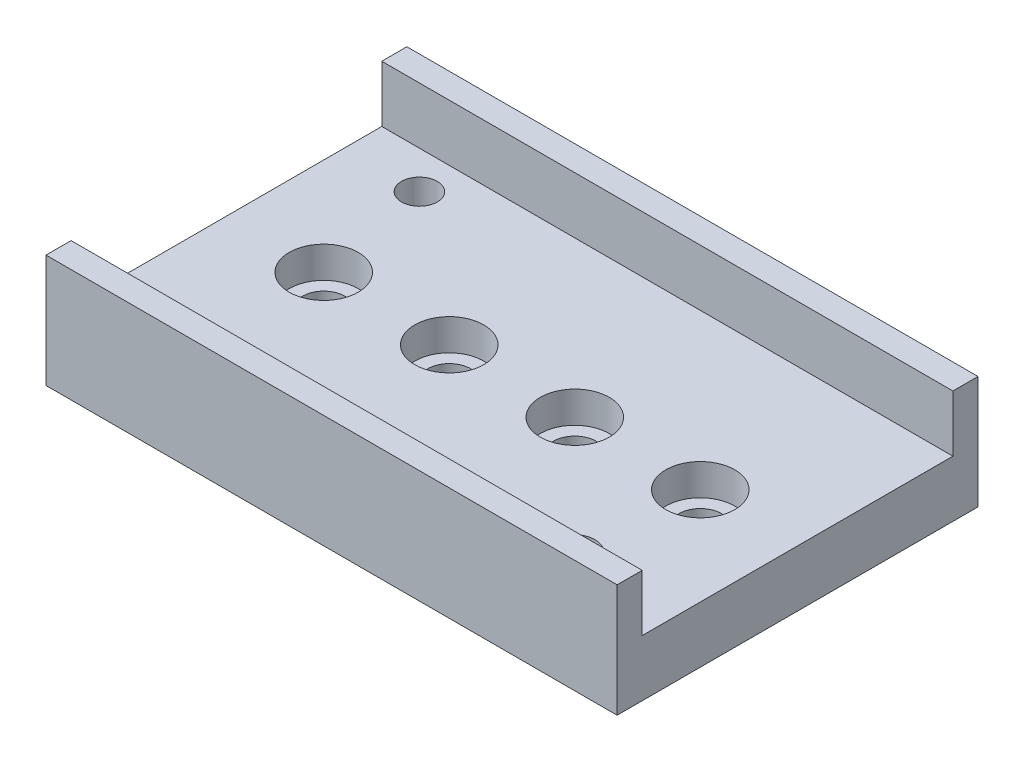
ISO-10303-21;
HEADER;
FILE_DESCRIPTION(('STEP AP214'),'2;1');
FILE_NAME('part.step','',(''),(''),'','','');
FILE_SCHEMA(('AUTOMOTIVE_DESIGN { 1 0 10303 214 1 1 1 1 }'));
ENDSEC;
DATA;
#1=APPLICATION_CONTEXT('core data for automotive mechanical design processes');
#2=APPLICATION_PROTOCOL_DEFINITION('international standard','automotive_design',2000,#1);
#3=PRODUCT_CONTEXT('',#1,'mechanical');
#4=PRODUCT('Part','Part','',(#3));
#5=PRODUCT_RELATED_PRODUCT_CATEGORY('part','',(#4));
#6=PRODUCT_DEFINITION_FORMATION('','',#4);
#7=PRODUCT_DEFINITION_CONTEXT('part definition',#1,'design');
#8=PRODUCT_DEFINITION('design','',#6,#7);
#9=PRODUCT_DEFINITION_SHAPE('','',#8);
#10=(LENGTH_UNIT() NAMED_UNIT(*) SI_UNIT(.MILLI.,.METRE.));
#11=(NAMED_UNIT(*) PLANE_ANGLE_UNIT() SI_UNIT($,.RADIAN.));
#12=(NAMED_UNIT(*) SI_UNIT($,.STERADIAN.) SOLID_ANGLE_UNIT());
#13=UNCERTAINTY_MEASURE_WITH_UNIT(LENGTH_MEASURE(1.E-05),#10,'distance_accuracy_value','');
#14=(GEOMETRIC_REPRESENTATION_CONTEXT(3) GLOBAL_UNCERTAINTY_ASSIGNED_CONTEXT((#13)) GLOBAL_UNIT_ASSIGNED_CONTEXT((#10,
#11,#12)) REPRESENTATION_CONTEXT('',''));
#15=CARTESIAN_POINT('',(0.,0.,0.));
#16=DIRECTION('',(0.,0.,1.));
#17=DIRECTION('',(1.,0.,0.));
#18=AXIS2_PLACEMENT_3D('',#15,#16,#17);
#19=CARTESIAN_POINT('',(0.,2.,0.));
#20=DIRECTION('',(0.,1.,0.));
#21=DIRECTION('',(0.,0.,1.));
#22=AXIS2_PLACEMENT_3D('',#19,#20,#21);
#23=PLANE('',#22);
#24=CARTESIAN_POINT('',(15.,2.,0.));
#25=DIRECTION('',(0.,1.,0.));
#26=DIRECTION('',(0.,0.,1.));
#27=AXIS2_PLACEMENT_3D('',#24,#25,#26);
#28=CIRCLE('',#27,1.7);
#29=CARTESIAN_POINT('',(15.,2.,1.7));
#30=VERTEX_POINT('',#29);
#31=EDGE_CURVE('E339',#30,#30,#28,.T.);
#32=ORIENTED_EDGE('',*,*,#31,.F.);
#33=EDGE_LOOP('',(#32));
#34=FACE_BOUND('',#33,.T.);
#35=CARTESIAN_POINT('',(15.,2.,0.));
#36=DIRECTION('',(0.,1.,0.));
#37=DIRECTION('',(0.,0.,1.));
#38=AXIS2_PLACEMENT_3D('',#35,#36,#37);
#39=CIRCLE('',#38,2.75);
#40=CARTESIAN_POINT('',(15.,2.,2.75));
#41=VERTEX_POINT('',#40);
#42=EDGE_CURVE('E11',#41,#41,#39,.F.);
#43=ORIENTED_EDGE('',*,*,#42,.F.);
#44=EDGE_LOOP('',(#43));
#45=FACE_BOUND('',#44,.T.);
#46=ADVANCED_FACE('F41',(#34,#45),#23,.T.);
#47=CARTESIAN_POINT('',(5.,2.,0.));
#48=DIRECTION('',(0.,1.,0.));
#49=DIRECTION('',(0.,0.,1.));
#50=AXIS2_PLACEMENT_3D('',#47,#48,#49);
#51=CIRCLE('',#50,1.7);
#52=CARTESIAN_POINT('',(5.,2.,1.7));
#53=VERTEX_POINT('',#52);
#54=EDGE_CURVE('E342',#53,#53,#51,.T.);
#55=ORIENTED_EDGE('',*,*,#54,.F.);
#56=EDGE_LOOP('',(#55));
#57=FACE_BOUND('',#56,.T.);
#58=CARTESIAN_POINT('',(5.,2.,0.));
#59=DIRECTION('',(0.,1.,0.));
#60=DIRECTION('',(0.,0.,1.));
#61=AXIS2_PLACEMENT_3D('',#58,#59,#60);
#62=CIRCLE('',#61,2.75);
#63=CARTESIAN_POINT('',(5.,2.,2.75));
#64=VERTEX_POINT('',#63);
#65=EDGE_CURVE('E50',#64,#64,#62,.F.);
#66=ORIENTED_EDGE('',*,*,#65,.F.);
#67=EDGE_LOOP('',(#66));
#68=FACE_BOUND('',#67,.T.);
#69=ADVANCED_FACE('F396',(#57,#68),#23,.T.);
#70=CARTESIAN_POINT('',(-5.,2.,0.));
#71=DIRECTION('',(0.,1.,0.));
#72=DIRECTION('',(0.,0.,1.));
#73=AXIS2_PLACEMENT_3D('',#70,#71,#72);
#74=CIRCLE('',#73,1.7);
#75=CARTESIAN_POINT('',(-5.,2.,1.7));
#76=VERTEX_POINT('',#75);
#77=EDGE_CURVE('E346',#76,#76,#74,.T.);
#78=ORIENTED_EDGE('',*,*,#77,.F.);
#79=EDGE_LOOP('',(#78));
#80=FACE_BOUND('',#79,.T.);
#81=CARTESIAN_POINT('',(-5.,2.,0.));
#82=DIRECTION('',(0.,1.,0.));
#83=DIRECTION('',(0.,0.,1.));
#84=AXIS2_PLACEMENT_3D('',#81,#82,#83);
#85=CIRCLE('',#84,2.75);
#86=CARTESIAN_POINT('',(-5.,2.,2.75));
#87=VERTEX_POINT('',#86);
#88=EDGE_CURVE('E388',#87,#87,#85,.F.);
#89=ORIENTED_EDGE('',*,*,#88,.F.);
#90=EDGE_LOOP('',(#89));
#91=FACE_BOUND('',#90,.T.);
#92=ADVANCED_FACE('F398',(#80,#91),#23,.T.);
#93=CARTESIAN_POINT('',(-15.,2.,0.));
#94=DIRECTION('',(0.,1.,0.));
#95=DIRECTION('',(0.,0.,1.));
#96=AXIS2_PLACEMENT_3D('',#93,#94,#95);
#97=CIRCLE('',#96,1.7);
#98=CARTESIAN_POINT('',(-15.,2.,1.7));
#99=VERTEX_POINT('',#98);
#100=EDGE_CURVE('E349',#99,#99,#97,.T.);
#101=ORIENTED_EDGE('',*,*,#100,.F.);
#102=EDGE_LOOP('',(#101));
#103=FACE_BOUND('',#102,.T.);
#104=CARTESIAN_POINT('',(-15.,2.,0.));
#105=DIRECTION('',(0.,1.,0.));
#106=DIRECTION('',(0.,0.,1.));
#107=AXIS2_PLACEMENT_3D('',#104,#105,#106);
#108=CIRCLE('',#107,2.75);
#109=CARTESIAN_POINT('',(-15.,2.,2.75));
#110=VERTEX_POINT('',#109);
#111=EDGE_CURVE('E383',#110,#110,#108,.F.);
#112=ORIENTED_EDGE('',*,*,#111,.F.);
#113=EDGE_LOOP('',(#112));
#114=FACE_BOUND('',#113,.T.);
#115=ADVANCED_FACE('F405',(#103,#114),#23,.T.);
#116=CARTESIAN_POINT('',(-22.75,2.,0.));
#117=DIRECTION('',(-1.,0.,0.));
#118=DIRECTION('',(0.,0.,1.));
#119=AXIS2_PLACEMENT_3D('',#116,#117,#118);
#120=PLANE('',#119);
#121=DIRECTION('',(0.,0.,-1.));
#122=VECTOR('',#121,1.);
#123=CARTESIAN_POINT('',(-22.75,0.,0.));
#124=LINE('',#123,#122);
#125=CARTESIAN_POINT('',(-22.75,0.,14.375));
#126=VERTEX_POINT('',#125);
#127=CARTESIAN_POINT('',(-22.75,0.,-14.375));
#128=VERTEX_POINT('',#127);
#129=EDGE_CURVE('E364',#126,#128,#124,.T.);
#130=ORIENTED_EDGE('',*,*,#129,.F.);
#131=DIRECTION('',(0.,-1.,0.));
#132=VECTOR('',#131,1.);
#133=CARTESIAN_POINT('',(-22.75,2.,14.375));
#134=LINE('',#133,#132);
#135=CARTESIAN_POINT('',(-22.75,9.,14.375));
#136=VERTEX_POINT('',#135);
#137=EDGE_CURVE('E381',#136,#126,#134,.T.);
#138=ORIENTED_EDGE('',*,*,#137,.F.);
#139=DIRECTION('',(0.,0.,1.));
#140=VECTOR('',#139,1.);
#141=CARTESIAN_POINT('',(-22.75,9.,12.375));
#142=LINE('',#141,#140);
#143=CARTESIAN_POINT('',(-22.75,9.,12.375));
#144=VERTEX_POINT('',#143);
#145=EDGE_CURVE('E316',#144,#136,#142,.T.);
#146=ORIENTED_EDGE('',*,*,#145,.F.);
#147=DIRECTION('',(0.,-1.,0.));
#148=VECTOR('',#147,1.);
#149=CARTESIAN_POINT('',(-22.75,9.,12.375));
#150=LINE('',#149,#148);
#151=CARTESIAN_POINT('',(-22.75,4.5,12.375));
#152=VERTEX_POINT('',#151);
#153=EDGE_CURVE('E304',#144,#152,#150,.T.);
#154=ORIENTED_EDGE('',*,*,#153,.T.);
#155=DIRECTION('',(0.,0.,1.));
#156=VECTOR('',#155,1.);
#157=CARTESIAN_POINT('',(-22.75,4.5,0.));
#158=LINE('',#157,#156);
#159=CARTESIAN_POINT('',(-22.75,4.5,-12.375));
#160=VERTEX_POINT('',#159);
#161=EDGE_CURVE('E293',#160,#152,#158,.T.);
#162=ORIENTED_EDGE('',*,*,#161,.F.);
#163=DIRECTION('',(0.,-1.,0.));
#164=VECTOR('',#163,1.);
#165=CARTESIAN_POINT('',(-22.75,9.,-12.375));
#166=LINE('',#165,#164);
#167=CARTESIAN_POINT('',(-22.75,9.,-12.375));
#168=VERTEX_POINT('',#167);
#169=EDGE_CURVE('E332',#168,#160,#166,.T.);
#170=ORIENTED_EDGE('',*,*,#169,.F.);
#171=DIRECTION('',(0.,0.,1.));
#172=VECTOR('',#171,1.);
#173=CARTESIAN_POINT('',(-22.75,9.,-14.375));
#174=LINE('',#173,#172);
#175=CARTESIAN_POINT('',(-22.75,9.,-14.375));
#176=VERTEX_POINT('',#175);
#177=EDGE_CURVE('E330',#176,#168,#174,.T.);
#178=ORIENTED_EDGE('',*,*,#177,.F.);
#179=DIRECTION('',(0.,-1.,0.));
#180=VECTOR('',#179,1.);
#181=CARTESIAN_POINT('',(-22.75,2.,-14.375));
#182=LINE('',#181,#180);
#183=EDGE_CURVE('E352',#176,#128,#182,.T.);
#184=ORIENTED_EDGE('',*,*,#183,.T.);
#185=EDGE_LOOP('',(#130,#138,#146,#154,#162,#170,#178,#184));
#186=FACE_BOUND('',#185,.T.);
#187=ADVANCED_FACE('F427',(#186),#120,.T.);
#188=CARTESIAN_POINT('',(0.,2.,14.375));
#189=DIRECTION('',(0.,0.,-1.));
#190=DIRECTION('',(-1.,0.,0.));
#191=AXIS2_PLACEMENT_3D('',#188,#189,#190);
#192=PLANE('',#191);
#193=DIRECTION('',(1.,0.,0.));
#194=VECTOR('',#193,1.);
#195=CARTESIAN_POINT('',(0.,0.,14.375));
#196=LINE('',#195,#194);
#197=CARTESIAN_POINT('',(22.75,0.,14.375));
#198=VERTEX_POINT('',#197);
#199=EDGE_CURVE('E367',#126,#198,#196,.T.);
#200=ORIENTED_EDGE('',*,*,#199,.T.);
#201=DIRECTION('',(0.,-1.,0.));
#202=VECTOR('',#201,1.);
#203=CARTESIAN_POINT('',(22.75,2.,14.375));
#204=LINE('',#203,#202);
#205=CARTESIAN_POINT('',(22.75,9.,14.375));
#206=VERTEX_POINT('',#205);
#207=EDGE_CURVE('E378',#206,#198,#204,.T.);
#208=ORIENTED_EDGE('',*,*,#207,.F.);
#209=DIRECTION('',(1.,0.,0.));
#210=VECTOR('',#209,1.);
#211=CARTESIAN_POINT('',(-22.75,9.,14.375));
#212=LINE('',#211,#210);
#213=EDGE_CURVE('E313',#136,#206,#212,.T.);
#214=ORIENTED_EDGE('',*,*,#213,.F.);
#215=ORIENTED_EDGE('',*,*,#137,.T.);
#216=EDGE_LOOP('',(#200,#208,#214,#215));
#217=FACE_BOUND('',#216,.T.);
#218=ADVANCED_FACE('F423',(#217),#192,.F.);
#219=CARTESIAN_POINT('',(22.75,2.,0.));
#220=DIRECTION('',(-1.,0.,0.));
#221=DIRECTION('',(0.,0.,1.));
#222=AXIS2_PLACEMENT_3D('',#219,#220,#221);
#223=PLANE('',#222);
#224=DIRECTION('',(0.,0.,-1.));
#225=VECTOR('',#224,1.);
#226=CARTESIAN_POINT('',(22.75,0.,0.));
#227=LINE('',#226,#225);
#228=CARTESIAN_POINT('',(22.75,0.,-14.375));
#229=VERTEX_POINT('',#228);
#230=EDGE_CURVE('E370',#198,#229,#227,.T.);
#231=ORIENTED_EDGE('',*,*,#230,.T.);
#232=DIRECTION('',(0.,-1.,0.));
#233=VECTOR('',#232,1.);
#234=CARTESIAN_POINT('',(22.75,2.,-14.375));
#235=LINE('',#234,#233);
#236=CARTESIAN_POINT('',(22.75,9.,-14.375));
#237=VERTEX_POINT('',#236);
#238=EDGE_CURVE('E376',#237,#229,#235,.T.);
#239=ORIENTED_EDGE('',*,*,#238,.F.);
#240=DIRECTION('',(0.,0.,-1.));
#241=VECTOR('',#240,1.);
#242=CARTESIAN_POINT('',(22.75,9.,-14.375));
#243=LINE('',#242,#241);
#244=CARTESIAN_POINT('',(22.75,9.,-12.375));
#245=VERTEX_POINT('',#244);
#246=EDGE_CURVE('E324',#245,#237,#243,.T.);
#247=ORIENTED_EDGE('',*,*,#246,.F.);
#248=DIRECTION('',(0.,-1.,0.));
#249=VECTOR('',#248,1.);
#250=CARTESIAN_POINT('',(22.75,9.,-12.375));
#251=LINE('',#250,#249);
#252=CARTESIAN_POINT('',(22.75,4.5,-12.375));
#253=VERTEX_POINT('',#252);
#254=EDGE_CURVE('E335',#245,#253,#251,.T.);
#255=ORIENTED_EDGE('',*,*,#254,.T.);
#256=DIRECTION('',(0.,0.,-1.));
#257=VECTOR('',#256,1.);
#258=CARTESIAN_POINT('',(22.75,4.5,0.));
#259=LINE('',#258,#257);
#260=CARTESIAN_POINT('',(22.75,4.5,12.375));
#261=VERTEX_POINT('',#260);
#262=EDGE_CURVE('E297',#261,#253,#259,.T.);
#263=ORIENTED_EDGE('',*,*,#262,.F.);
#264=DIRECTION('',(0.,-1.,0.));
#265=VECTOR('',#264,1.);
#266=CARTESIAN_POINT('',(22.75,9.,12.375));
#267=LINE('',#266,#265);
#268=CARTESIAN_POINT('',(22.75,9.,12.375));
#269=VERTEX_POINT('',#268);
#270=EDGE_CURVE('E307',#269,#261,#267,.T.);
#271=ORIENTED_EDGE('',*,*,#270,.F.);
#272=DIRECTION('',(0.,0.,-1.));
#273=VECTOR('',#272,1.);
#274=CARTESIAN_POINT('',(22.75,9.,12.375));
#275=LINE('',#274,#273);
#276=EDGE_CURVE('E310',#206,#269,#275,.T.);
#277=ORIENTED_EDGE('',*,*,#276,.F.);
#278=ORIENTED_EDGE('',*,*,#207,.T.);
#279=EDGE_LOOP('',(#231,#239,#247,#255,#263,#271,#277,#278));
#280=FACE_BOUND('',#279,.T.);
#281=ADVANCED_FACE('F419',(#280),#223,.F.);
#282=CARTESIAN_POINT('',(-15.,2.,0.));
#283=DIRECTION('',(0.,-1.,0.));
#284=DIRECTION('',(0.,0.,-1.));
#285=AXIS2_PLACEMENT_3D('',#282,#283,#284);
#286=CYLINDRICAL_SURFACE('',#285,1.7);
#287=ORIENTED_EDGE('',*,*,#100,.T.);
#288=EDGE_LOOP('',(#287));
#289=FACE_BOUND('',#288,.T.);
#290=CARTESIAN_POINT('',(-15.,0.,0.));
#291=DIRECTION('',(0.,1.,0.));
#292=DIRECTION('',(0.,0.,1.));
#293=AXIS2_PLACEMENT_3D('',#290,#291,#292);
#294=CIRCLE('',#293,1.7);
#295=CARTESIAN_POINT('',(-15.,0.,1.7));
#296=VERTEX_POINT('',#295);
#297=EDGE_CURVE('E361',#296,#296,#294,.T.);
#298=ORIENTED_EDGE('',*,*,#297,.F.);
#299=EDGE_LOOP('',(#298));
#300=FACE_BOUND('',#299,.T.);
#301=ADVANCED_FACE('F422',(#289,#300),#286,.F.);
#302=CARTESIAN_POINT('',(-5.,2.,0.));
#303=DIRECTION('',(0.,-1.,0.));
#304=DIRECTION('',(0.,0.,-1.));
#305=AXIS2_PLACEMENT_3D('',#302,#303,#304);
#306=CYLINDRICAL_SURFACE('',#305,1.7);
#307=ORIENTED_EDGE('',*,*,#77,.T.);
#308=EDGE_LOOP('',(#307));
#309=FACE_BOUND('',#308,.T.);
#310=CARTESIAN_POINT('',(-5.,0.,0.));
#311=DIRECTION('',(0.,1.,0.));
#312=DIRECTION('',(0.,0.,1.));
#313=AXIS2_PLACEMENT_3D('',#310,#311,#312);
#314=CIRCLE('',#313,1.7);
#315=CARTESIAN_POINT('',(-5.,0.,1.7));
#316=VERTEX_POINT('',#315);
#317=EDGE_CURVE('E358',#316,#316,#314,.T.);
#318=ORIENTED_EDGE('',*,*,#317,.F.);
#319=EDGE_LOOP('',(#318));
#320=FACE_BOUND('',#319,.T.);
#321=ADVANCED_FACE('F434',(#309,#320),#306,.F.);
#322=CARTESIAN_POINT('',(5.,2.,0.));
#323=DIRECTION('',(0.,-1.,0.));
#324=DIRECTION('',(0.,0.,-1.));
#325=AXIS2_PLACEMENT_3D('',#322,#323,#324);
#326=CYLINDRICAL_SURFACE('',#325,1.7);
#327=ORIENTED_EDGE('',*,*,#54,.T.);
#328=EDGE_LOOP('',(#327));
#329=FACE_BOUND('',#328,.T.);
#330=CARTESIAN_POINT('',(5.,0.,0.));
#331=DIRECTION('',(0.,1.,0.));
#332=DIRECTION('',(0.,0.,1.));
#333=AXIS2_PLACEMENT_3D('',#330,#331,#332);
#334=CIRCLE('',#333,1.7);
#335=CARTESIAN_POINT('',(5.,0.,1.7));
#336=VERTEX_POINT('',#335);
#337=EDGE_CURVE('E355',#336,#336,#334,.T.);
#338=ORIENTED_EDGE('',*,*,#337,.F.);
#339=EDGE_LOOP('',(#338));
#340=FACE_BOUND('',#339,.T.);
#341=ADVANCED_FACE('F437',(#329,#340),#326,.F.);
#342=CARTESIAN_POINT('',(15.,2.,0.));
#343=DIRECTION('',(0.,-1.,0.));
#344=DIRECTION('',(0.,0.,-1.));
#345=AXIS2_PLACEMENT_3D('',#342,#343,#344);
#346=CYLINDRICAL_SURFACE('',#345,1.7);
#347=ORIENTED_EDGE('',*,*,#31,.T.);
#348=EDGE_LOOP('',(#347));
#349=FACE_BOUND('',#348,.T.);
#350=CARTESIAN_POINT('',(15.,0.,0.));
#351=DIRECTION('',(0.,1.,0.));
#352=DIRECTION('',(0.,0.,1.));
#353=AXIS2_PLACEMENT_3D('',#350,#351,#352);
#354=CIRCLE('',#353,1.7);
#355=CARTESIAN_POINT('',(15.,0.,1.7));
#356=VERTEX_POINT('',#355);
#357=EDGE_CURVE('E338',#356,#356,#354,.T.);
#358=ORIENTED_EDGE('',*,*,#357,.F.);
#359=EDGE_LOOP('',(#358));
#360=FACE_BOUND('',#359,.T.);
#361=ADVANCED_FACE('F43',(#349,#360),#346,.F.);
#362=CARTESIAN_POINT('',(0.,2.,-14.375));
#363=DIRECTION('',(0.,0.,-1.));
#364=DIRECTION('',(-1.,0.,0.));
#365=AXIS2_PLACEMENT_3D('',#362,#363,#364);
#366=PLANE('',#365);
#367=DIRECTION('',(1.,0.,0.));
#368=VECTOR('',#367,1.);
#369=CARTESIAN_POINT('',(0.,0.,-14.375));
#370=LINE('',#369,#368);
#371=EDGE_CURVE('E343',#128,#229,#370,.T.);
#372=ORIENTED_EDGE('',*,*,#371,.F.);
#373=ORIENTED_EDGE('',*,*,#183,.F.);
#374=DIRECTION('',(-1.,0.,0.));
#375=VECTOR('',#374,1.);
#376=CARTESIAN_POINT('',(-22.75,9.,-14.375));
#377=LINE('',#376,#375);
#378=EDGE_CURVE('E327',#237,#176,#377,.T.);
#379=ORIENTED_EDGE('',*,*,#378,.F.);
#380=ORIENTED_EDGE('',*,*,#238,.T.);
#381=EDGE_LOOP('',(#372,#373,#379,#380));
#382=FACE_BOUND('',#381,.T.);
#383=ADVANCED_FACE('F415',(#382),#366,.T.);
#384=CARTESIAN_POINT('',(0.,0.,0.));
#385=DIRECTION('',(0.,1.,0.));
#386=DIRECTION('',(0.,0.,1.));
#387=AXIS2_PLACEMENT_3D('',#384,#385,#386);
#388=PLANE('',#387);
#389=DIRECTION('',(1.,0.,0.));
#390=VECTOR('',#389,1.);
#391=CARTESIAN_POINT('',(-15.191154273188,0.,-12.075));
#392=LINE('',#391,#390);
#393=CARTESIAN_POINT('',(-18.308845726812,0.,-12.075));
#394=VERTEX_POINT('',#393);
#395=CARTESIAN_POINT('',(-15.191154273188,0.,-12.075));
#396=VERTEX_POINT('',#395);
#397=EDGE_CURVE('E203',#394,#396,#392,.T.);
#398=ORIENTED_EDGE('',*,*,#397,.F.);
#399=DIRECTION('',(0.5,0.,-0.866025403784439));
#400=VECTOR('',#399,1.);
#401=CARTESIAN_POINT('',(-18.308845726812,0.,-12.075));
#402=LINE('',#401,#400);
#403=CARTESIAN_POINT('',(-19.867691453624,0.,-9.375));
#404=VERTEX_POINT('',#403);
#405=EDGE_CURVE('E183',#404,#394,#402,.T.);
#406=ORIENTED_EDGE('',*,*,#405,.F.);
#407=DIRECTION('',(-0.5,0.,-0.866025403784438));
#408=VECTOR('',#407,1.);
#409=CARTESIAN_POINT('',(-19.867691453624,0.,-9.375));
#410=LINE('',#409,#408);
#411=CARTESIAN_POINT('',(-18.308845726812,0.,-6.67499999999999));
#412=VERTEX_POINT('',#411);
#413=EDGE_CURVE('E194',#412,#404,#410,.T.);
#414=ORIENTED_EDGE('',*,*,#413,.F.);
#415=DIRECTION('',(-1.,0.,0.));
#416=VECTOR('',#415,1.);
#417=CARTESIAN_POINT('',(-18.308845726812,0.,-6.67499999999999));
#418=LINE('',#417,#416);
#419=CARTESIAN_POINT('',(-15.191154273188,0.,-6.67499999999999));
#420=VERTEX_POINT('',#419);
#421=EDGE_CURVE('E57',#420,#412,#418,.T.);
#422=ORIENTED_EDGE('',*,*,#421,.F.);
#423=DIRECTION('',(-0.5,0.,0.866025403784439));
#424=VECTOR('',#423,1.);
#425=CARTESIAN_POINT('',(-15.191154273188,0.,-6.67499999999999));
#426=LINE('',#425,#424);
#427=CARTESIAN_POINT('',(-13.632308546376,0.,-9.375));
#428=VERTEX_POINT('',#427);
#429=EDGE_CURVE('E816',#428,#420,#426,.T.);
#430=ORIENTED_EDGE('',*,*,#429,.F.);
#431=DIRECTION('',(0.5,0.,0.866025403784439));
#432=VECTOR('',#431,1.);
#433=CARTESIAN_POINT('',(-13.632308546376,0.,-9.375));
#434=LINE('',#433,#432);
#435=EDGE_CURVE('E207',#396,#428,#434,.T.);
#436=ORIENTED_EDGE('',*,*,#435,.F.);
#437=EDGE_LOOP('',(#398,#406,#414,#422,#430,#436));
#438=FACE_BOUND('',#437,.T.);
#439=DIRECTION('',(-0.0787707958382025,0.,0.996892753370701));
#440=VECTOR('',#439,1.);
#441=CARTESIAN_POINT('',(16.8188189156109,0.,11.0916831574449));
#442=LINE('',#441,#440);
#443=CARTESIAN_POINT('',(17.0644019525909,0.,7.98367914008139));
#444=VERTEX_POINT('',#443);
#445=CARTESIAN_POINT('',(16.8188189156109,0.,11.0916831574449));
#446=VERTEX_POINT('',#445);
#447=EDGE_CURVE('E267',#444,#446,#442,.T.);
#448=ORIENTED_EDGE('',*,*,#447,.F.);
#449=DIRECTION('',(0.82394905134854,0.,0.566663886957551));
#450=VECTOR('',#449,1.);
#451=CARTESIAN_POINT('',(17.0644019525909,0.,7.98367914008139));
#452=LINE('',#451,#450);
#453=CARTESIAN_POINT('',(14.4955830369799,0.,6.21699598263649));
#454=VERTEX_POINT('',#453);
#455=EDGE_CURVE('E264',#454,#444,#452,.T.);
#456=ORIENTED_EDGE('',*,*,#455,.F.);
#457=DIRECTION('',(0.902719847186743,0.,-0.430228866413149));
#458=VECTOR('',#457,1.);
#459=CARTESIAN_POINT('',(14.4955830369799,0.,6.21699598263649));
#460=LINE('',#459,#458);
#461=CARTESIAN_POINT('',(11.6811810843891,0.,7.55831684255509));
#462=VERTEX_POINT('',#461);
#463=EDGE_CURVE('E231',#462,#454,#460,.T.);
#464=ORIENTED_EDGE('',*,*,#463,.F.);
#465=DIRECTION('',(0.0787707958382025,0.,-0.996892753370701));
#466=VECTOR('',#465,1.);
#467=CARTESIAN_POINT('',(11.6811810843891,0.,7.5583168425551));
#468=LINE('',#467,#466);
#469=CARTESIAN_POINT('',(11.4355980474092,0.,10.6663208599186));
#470=VERTEX_POINT('',#469);
#471=EDGE_CURVE('E65',#470,#462,#468,.T.);
#472=ORIENTED_EDGE('',*,*,#471,.F.);
#473=DIRECTION('',(-0.82394905134854,0.,-0.566663886957551));
#474=VECTOR('',#473,1.);
#475=CARTESIAN_POINT('',(11.4355980474092,0.,10.6663208599186));
#476=LINE('',#475,#474);
#477=CARTESIAN_POINT('',(14.0044169630201,0.,12.4330040173635));
#478=VERTEX_POINT('',#477);
#479=EDGE_CURVE('E273',#478,#470,#476,.T.);
#480=ORIENTED_EDGE('',*,*,#479,.F.);
#481=DIRECTION('',(-0.902719847186743,0.,0.430228866413149));
#482=VECTOR('',#481,1.);
#483=CARTESIAN_POINT('',(14.0044169630201,0.,12.4330040173635));
#484=LINE('',#483,#482);
#485=EDGE_CURVE('E270',#446,#478,#484,.T.);
#486=ORIENTED_EDGE('',*,*,#485,.F.);
#487=EDGE_LOOP('',(#448,#456,#464,#472,#480,#486));
#488=FACE_BOUND('',#487,.T.);
#489=ORIENTED_EDGE('',*,*,#357,.T.);
#490=EDGE_LOOP('',(#489));
#491=FACE_BOUND('',#490,.T.);
#492=ORIENTED_EDGE('',*,*,#337,.T.);
#493=EDGE_LOOP('',(#492));
#494=FACE_BOUND('',#493,.T.);
#495=ORIENTED_EDGE('',*,*,#317,.T.);
#496=EDGE_LOOP('',(#495));
#497=FACE_BOUND('',#496,.T.);
#498=ORIENTED_EDGE('',*,*,#297,.T.);
#499=EDGE_LOOP('',(#498));
#500=FACE_BOUND('',#499,.T.);
#501=ORIENTED_EDGE('',*,*,#129,.T.);
#502=ORIENTED_EDGE('',*,*,#371,.T.);
#503=ORIENTED_EDGE('',*,*,#230,.F.);
#504=ORIENTED_EDGE('',*,*,#199,.F.);
#505=EDGE_LOOP('',(#501,#502,#503,#504));
#506=FACE_BOUND('',#505,.T.);
#507=ADVANCED_FACE('F199',(#438,#488,#491,#494,#497,#500,#506),#388,.F.);
#508=CARTESIAN_POINT('',(20.75,9.,-12.375));
#509=DIRECTION('',(0.,0.,-1.));
#510=DIRECTION('',(-1.,0.,0.));
#511=AXIS2_PLACEMENT_3D('',#508,#509,#510);
#512=PLANE('',#511);
#513=ORIENTED_EDGE('',*,*,#169,.T.);
#514=DIRECTION('',(-1.,0.,0.));
#515=VECTOR('',#514,1.);
#516=CARTESIAN_POINT('',(0.,4.5,-12.375));
#517=LINE('',#516,#515);
#518=EDGE_CURVE('E299',#253,#160,#517,.T.);
#519=ORIENTED_EDGE('',*,*,#518,.F.);
#520=ORIENTED_EDGE('',*,*,#254,.F.);
#521=DIRECTION('',(1.,0.,0.));
#522=VECTOR('',#521,1.);
#523=CARTESIAN_POINT('',(-20.75,9.,-12.375));
#524=LINE('',#523,#522);
#525=EDGE_CURVE('E322',#168,#245,#524,.T.);
#526=ORIENTED_EDGE('',*,*,#525,.F.);
#527=EDGE_LOOP('',(#513,#519,#520,#526));
#528=FACE_BOUND('',#527,.T.);
#529=ADVANCED_FACE('F411',(#528),#512,.F.);
#530=CARTESIAN_POINT('',(0.,9.,0.));
#531=DIRECTION('',(0.,1.,0.));
#532=DIRECTION('',(0.,0.,1.));
#533=AXIS2_PLACEMENT_3D('',#530,#531,#532);
#534=PLANE('',#533);
#535=ORIENTED_EDGE('',*,*,#525,.T.);
#536=ORIENTED_EDGE('',*,*,#246,.T.);
#537=ORIENTED_EDGE('',*,*,#378,.T.);
#538=ORIENTED_EDGE('',*,*,#177,.T.);
#539=EDGE_LOOP('',(#535,#536,#537,#538));
#540=FACE_BOUND('',#539,.T.);
#541=ADVANCED_FACE('F476',(#540),#534,.T.);
#542=CARTESIAN_POINT('',(-20.75,9.,12.375));
#543=DIRECTION('',(0.,0.,1.));
#544=DIRECTION('',(1.,0.,0.));
#545=AXIS2_PLACEMENT_3D('',#542,#543,#544);
#546=PLANE('',#545);
#547=ORIENTED_EDGE('',*,*,#270,.T.);
#548=DIRECTION('',(1.,0.,0.));
#549=VECTOR('',#548,1.);
#550=CARTESIAN_POINT('',(0.,4.5,12.375));
#551=LINE('',#550,#549);
#552=EDGE_CURVE('E295',#152,#261,#551,.T.);
#553=ORIENTED_EDGE('',*,*,#552,.F.);
#554=ORIENTED_EDGE('',*,*,#153,.F.);
#555=DIRECTION('',(-1.,0.,0.));
#556=VECTOR('',#555,1.);
#557=CARTESIAN_POINT('',(-20.75,9.,12.375));
#558=LINE('',#557,#556);
#559=EDGE_CURVE('E319',#269,#144,#558,.T.);
#560=ORIENTED_EDGE('',*,*,#559,.F.);
#561=EDGE_LOOP('',(#547,#553,#554,#560));
#562=FACE_BOUND('',#561,.T.);
#563=ADVANCED_FACE('F466',(#562),#546,.F.);
#564=CARTESIAN_POINT('',(0.,9.,0.));
#565=DIRECTION('',(0.,1.,0.));
#566=DIRECTION('',(0.,0.,1.));
#567=AXIS2_PLACEMENT_3D('',#564,#565,#566);
#568=PLANE('',#567);
#569=ORIENTED_EDGE('',*,*,#559,.T.);
#570=ORIENTED_EDGE('',*,*,#145,.T.);
#571=ORIENTED_EDGE('',*,*,#213,.T.);
#572=ORIENTED_EDGE('',*,*,#276,.T.);
#573=EDGE_LOOP('',(#569,#570,#571,#572));
#574=FACE_BOUND('',#573,.T.);
#575=ADVANCED_FACE('F462',(#574),#568,.T.);
#576=CARTESIAN_POINT('',(-16.75,4.5,-9.375));
#577=DIRECTION('',(0.,-1.,0.));
#578=DIRECTION('',(0.,0.,-1.));
#579=AXIS2_PLACEMENT_3D('',#576,#577,#578);
#580=CYLINDRICAL_SURFACE('',#579,1.425);
#581=CARTESIAN_POINT('',(-16.75,4.5,-9.375));
#582=DIRECTION('',(0.,1.,0.));
#583=DIRECTION('',(0.,0.,1.));
#584=AXIS2_PLACEMENT_3D('',#581,#582,#583);
#585=CIRCLE('',#584,1.425);
#586=CARTESIAN_POINT('',(-16.75,4.5,-7.95));
#587=VERTEX_POINT('',#586);
#588=EDGE_CURVE('E290',#587,#587,#585,.T.);
#589=ORIENTED_EDGE('',*,*,#588,.T.);
#590=EDGE_LOOP('',(#589));
#591=FACE_BOUND('',#590,.T.);
#592=CARTESIAN_POINT('',(-16.75,2.,-9.375));
#593=DIRECTION('',(0.,1.,0.));
#594=DIRECTION('',(0.,0.,1.));
#595=AXIS2_PLACEMENT_3D('',#592,#593,#594);
#596=CIRCLE('',#595,1.425);
#597=CARTESIAN_POINT('',(-16.75,2.,-7.95));
#598=VERTEX_POINT('',#597);
#599=EDGE_CURVE('E45',#598,#598,#596,.F.);
#600=ORIENTED_EDGE('',*,*,#599,.T.);
#601=EDGE_LOOP('',(#600));
#602=FACE_BOUND('',#601,.T.);
#603=ADVANCED_FACE('F507',(#591,#602),#580,.F.);
#604=CARTESIAN_POINT('',(15.,4.5,0.));
#605=DIRECTION('',(0.,-1.,0.));
#606=DIRECTION('',(0.,0.,-1.));
#607=AXIS2_PLACEMENT_3D('',#604,#605,#606);
#608=CYLINDRICAL_SURFACE('',#607,2.75);
#609=CARTESIAN_POINT('',(15.,4.5,0.));
#610=DIRECTION('',(0.,1.,0.));
#611=DIRECTION('',(0.,0.,1.));
#612=AXIS2_PLACEMENT_3D('',#609,#610,#611);
#613=CIRCLE('',#612,2.75);
#614=CARTESIAN_POINT('',(15.,4.5,2.75));
#615=VERTEX_POINT('',#614);
#616=EDGE_CURVE('E287',#615,#615,#613,.T.);
#617=ORIENTED_EDGE('',*,*,#616,.T.);
#618=EDGE_LOOP('',(#617));
#619=FACE_BOUND('',#618,.T.);
#620=ORIENTED_EDGE('',*,*,#42,.T.);
#621=EDGE_LOOP('',(#620));
#622=FACE_BOUND('',#621,.T.);
#623=ADVANCED_FACE('F510',(#619,#622),#608,.F.);
#624=CARTESIAN_POINT('',(5.,4.5,0.));
#625=DIRECTION('',(0.,-1.,0.));
#626=DIRECTION('',(0.,0.,-1.));
#627=AXIS2_PLACEMENT_3D('',#624,#625,#626);
#628=CYLINDRICAL_SURFACE('',#627,2.75);
#629=CARTESIAN_POINT('',(5.,4.5,0.));
#630=DIRECTION('',(0.,1.,0.));
#631=DIRECTION('',(0.,0.,1.));
#632=AXIS2_PLACEMENT_3D('',#629,#630,#631);
#633=CIRCLE('',#632,2.75);
#634=CARTESIAN_POINT('',(5.,4.5,2.75));
#635=VERTEX_POINT('',#634);
#636=EDGE_CURVE('E284',#635,#635,#633,.T.);
#637=ORIENTED_EDGE('',*,*,#636,.T.);
#638=EDGE_LOOP('',(#637));
#639=FACE_BOUND('',#638,.T.);
#640=ORIENTED_EDGE('',*,*,#65,.T.);
#641=EDGE_LOOP('',(#640));
#642=FACE_BOUND('',#641,.T.);
#643=ADVANCED_FACE('F394',(#639,#642),#628,.F.);
#644=CARTESIAN_POINT('',(-5.,4.5,0.));
#645=DIRECTION('',(0.,-1.,0.));
#646=DIRECTION('',(0.,0.,-1.));
#647=AXIS2_PLACEMENT_3D('',#644,#645,#646);
#648=CYLINDRICAL_SURFACE('',#647,2.75);
#649=CARTESIAN_POINT('',(-5.,4.5,0.));
#650=DIRECTION('',(0.,1.,0.));
#651=DIRECTION('',(0.,0.,1.));
#652=AXIS2_PLACEMENT_3D('',#649,#650,#651);
#653=CIRCLE('',#652,2.75);
#654=CARTESIAN_POINT('',(-5.,4.5,2.75));
#655=VERTEX_POINT('',#654);
#656=EDGE_CURVE('E280',#655,#655,#653,.T.);
#657=ORIENTED_EDGE('',*,*,#656,.T.);
#658=EDGE_LOOP('',(#657));
#659=FACE_BOUND('',#658,.T.);
#660=ORIENTED_EDGE('',*,*,#88,.T.);
#661=EDGE_LOOP('',(#660));
#662=FACE_BOUND('',#661,.T.);
#663=ADVANCED_FACE('F517',(#659,#662),#648,.F.);
#664=CARTESIAN_POINT('',(-15.,4.5,0.));
#665=DIRECTION('',(0.,-1.,0.));
#666=DIRECTION('',(0.,0.,-1.));
#667=AXIS2_PLACEMENT_3D('',#664,#665,#666);
#668=CYLINDRICAL_SURFACE('',#667,2.75);
#669=CARTESIAN_POINT('',(-15.,4.5,0.));
#670=DIRECTION('',(0.,1.,0.));
#671=DIRECTION('',(0.,0.,1.));
#672=AXIS2_PLACEMENT_3D('',#669,#670,#671);
#673=CIRCLE('',#672,2.75);
#674=CARTESIAN_POINT('',(-15.,4.5,2.75));
#675=VERTEX_POINT('',#674);
#676=EDGE_CURVE('E277',#675,#675,#673,.T.);
#677=ORIENTED_EDGE('',*,*,#676,.T.);
#678=EDGE_LOOP('',(#677));
#679=FACE_BOUND('',#678,.T.);
#680=ORIENTED_EDGE('',*,*,#111,.T.);
#681=EDGE_LOOP('',(#680));
#682=FACE_BOUND('',#681,.T.);
#683=ADVANCED_FACE('F489',(#679,#682),#668,.F.);
#684=CARTESIAN_POINT('',(14.25,4.5,9.325));
#685=DIRECTION('',(0.,-1.,0.));
#686=DIRECTION('',(0.,0.,-1.));
#687=AXIS2_PLACEMENT_3D('',#684,#685,#686);
#688=CYLINDRICAL_SURFACE('',#687,1.68502818872112);
#689=CARTESIAN_POINT('',(14.25,4.5,9.325));
#690=DIRECTION('',(0.,1.,0.));
#691=DIRECTION('',(0.,0.,1.));
#692=AXIS2_PLACEMENT_3D('',#689,#690,#691);
#693=CIRCLE('',#692,1.68502818872112);
#694=CARTESIAN_POINT('',(14.25,4.5,11.0100281887211));
#695=VERTEX_POINT('',#694);
#696=EDGE_CURVE('E301',#695,#695,#693,.T.);
#697=ORIENTED_EDGE('',*,*,#696,.T.);
#698=EDGE_LOOP('',(#697));
#699=FACE_BOUND('',#698,.T.);
#700=CARTESIAN_POINT('',(14.25,2.,9.325));
#701=DIRECTION('',(0.,1.,0.));
#702=DIRECTION('',(0.,0.,1.));
#703=AXIS2_PLACEMENT_3D('',#700,#701,#702);
#704=CIRCLE('',#703,1.68502818872112);
#705=CARTESIAN_POINT('',(14.25,2.,11.0100281887211));
#706=VERTEX_POINT('',#705);
#707=EDGE_CURVE('E281',#706,#706,#704,.F.);
#708=ORIENTED_EDGE('',*,*,#707,.T.);
#709=EDGE_LOOP('',(#708));
#710=FACE_BOUND('',#709,.T.);
#711=ADVANCED_FACE('F482',(#699,#710),#688,.F.);
#712=CARTESIAN_POINT('',(0.,4.5,0.));
#713=DIRECTION('',(0.,1.,0.));
#714=DIRECTION('',(0.,0.,1.));
#715=AXIS2_PLACEMENT_3D('',#712,#713,#714);
#716=PLANE('',#715);
#717=ORIENTED_EDGE('',*,*,#676,.F.);
#718=EDGE_LOOP('',(#717));
#719=FACE_BOUND('',#718,.T.);
#720=ORIENTED_EDGE('',*,*,#656,.F.);
#721=EDGE_LOOP('',(#720));
#722=FACE_BOUND('',#721,.T.);
#723=ORIENTED_EDGE('',*,*,#636,.F.);
#724=EDGE_LOOP('',(#723));
#725=FACE_BOUND('',#724,.T.);
#726=ORIENTED_EDGE('',*,*,#616,.F.);
#727=EDGE_LOOP('',(#726));
#728=FACE_BOUND('',#727,.T.);
#729=ORIENTED_EDGE('',*,*,#588,.F.);
#730=EDGE_LOOP('',(#729));
#731=FACE_BOUND('',#730,.T.);
#732=ORIENTED_EDGE('',*,*,#161,.T.);
#733=ORIENTED_EDGE('',*,*,#552,.T.);
#734=ORIENTED_EDGE('',*,*,#262,.T.);
#735=ORIENTED_EDGE('',*,*,#518,.T.);
#736=EDGE_LOOP('',(#732,#733,#734,#735));
#737=FACE_BOUND('',#736,.T.);
#738=ORIENTED_EDGE('',*,*,#696,.F.);
#739=EDGE_LOOP('',(#738));
#740=FACE_BOUND('',#739,.T.);
#741=ADVANCED_FACE('F478',(#719,#722,#725,#728,#731,#737,#740),#716,.T.);
#742=CARTESIAN_POINT('',(0.,2.,0.));
#743=DIRECTION('',(0.,1.,0.));
#744=DIRECTION('',(0.,0.,1.));
#745=AXIS2_PLACEMENT_3D('',#742,#743,#744);
#746=PLANE('',#745);
#747=DIRECTION('',(-0.82394905134854,0.,-0.566663886957551));
#748=VECTOR('',#747,1.);
#749=CARTESIAN_POINT('',(17.0644019525909,2.,7.98367914008139));
#750=LINE('',#749,#748);
#751=CARTESIAN_POINT('',(17.0644019525909,2.,7.98367914008139));
#752=VERTEX_POINT('',#751);
#753=CARTESIAN_POINT('',(14.4955830369799,2.,6.21699598263649));
#754=VERTEX_POINT('',#753);
#755=EDGE_CURVE('E261',#752,#754,#750,.T.);
#756=ORIENTED_EDGE('',*,*,#755,.F.);
#757=DIRECTION('',(0.0787707958382025,0.,-0.9968927533707));
#758=VECTOR('',#757,1.);
#759=CARTESIAN_POINT('',(16.8188189156109,2.,11.0916831574449));
#760=LINE('',#759,#758);
#761=CARTESIAN_POINT('',(16.8188189156109,2.,11.0916831574449));
#762=VERTEX_POINT('',#761);
#763=EDGE_CURVE('E237',#762,#752,#760,.T.);
#764=ORIENTED_EDGE('',*,*,#763,.F.);
#765=DIRECTION('',(0.902719847186743,0.,-0.430228866413149));
#766=VECTOR('',#765,1.);
#767=CARTESIAN_POINT('',(14.0044169630201,2.,12.4330040173635));
#768=LINE('',#767,#766);
#769=CARTESIAN_POINT('',(14.0044169630201,2.,12.4330040173635));
#770=VERTEX_POINT('',#769);
#771=EDGE_CURVE('E249',#770,#762,#768,.T.);
#772=ORIENTED_EDGE('',*,*,#771,.F.);
#773=DIRECTION('',(0.82394905134854,0.,0.566663886957551));
#774=VECTOR('',#773,1.);
#775=CARTESIAN_POINT('',(11.4355980474092,2.,10.6663208599186));
#776=LINE('',#775,#774);
#777=CARTESIAN_POINT('',(11.4355980474092,2.,10.6663208599186));
#778=VERTEX_POINT('',#777);
#779=EDGE_CURVE('E252',#778,#770,#776,.T.);
#780=ORIENTED_EDGE('',*,*,#779,.F.);
#781=DIRECTION('',(-0.0787707958382025,0.,0.9968927533707));
#782=VECTOR('',#781,1.);
#783=CARTESIAN_POINT('',(11.6811810843891,2.,7.5583168425551));
#784=LINE('',#783,#782);
#785=CARTESIAN_POINT('',(11.6811810843891,2.,7.5583168425551));
#786=VERTEX_POINT('',#785);
#787=EDGE_CURVE('E255',#786,#778,#784,.T.);
#788=ORIENTED_EDGE('',*,*,#787,.F.);
#789=DIRECTION('',(-0.902719847186743,0.,0.430228866413149));
#790=VECTOR('',#789,1.);
#791=CARTESIAN_POINT('',(14.4955830369799,2.,6.21699598263649));
#792=LINE('',#791,#790);
#793=EDGE_CURVE('E258',#754,#786,#792,.T.);
#794=ORIENTED_EDGE('',*,*,#793,.F.);
#795=EDGE_LOOP('',(#756,#764,#772,#780,#788,#794));
#796=FACE_BOUND('',#795,.T.);
#797=ORIENTED_EDGE('',*,*,#707,.F.);
#798=EDGE_LOOP('',(#797));
#799=FACE_BOUND('',#798,.T.);
#800=ADVANCED_FACE('F481',(#796,#799),#746,.F.);
#801=CARTESIAN_POINT('',(17.0644019525909,-0.00100000000000013,7.98367914008139));
#802=DIRECTION('',(0.566663886957551,0.,-0.82394905134854));
#803=DIRECTION('',(-0.82394905134854,0.,-0.566663886957551));
#804=AXIS2_PLACEMENT_3D('',#801,#802,#803);
#805=PLANE('',#804);
#806=ORIENTED_EDGE('',*,*,#455,.T.);
#807=DIRECTION('',(0.,1.,0.));
#808=VECTOR('',#807,1.);
#809=CARTESIAN_POINT('',(17.0644019525909,-0.00100000000000013,7.98367914008139));
#810=LINE('',#809,#808);
#811=EDGE_CURVE('E234',#444,#752,#810,.T.);
#812=ORIENTED_EDGE('',*,*,#811,.T.);
#813=ORIENTED_EDGE('',*,*,#755,.T.);
#814=DIRECTION('',(0.,1.,0.));
#815=VECTOR('',#814,1.);
#816=CARTESIAN_POINT('',(14.4955830369799,-0.00100000000000013,6.21699598263649));
#817=LINE('',#816,#815);
#818=EDGE_CURVE('E235',#454,#754,#817,.T.);
#819=ORIENTED_EDGE('',*,*,#818,.F.);
#820=EDGE_LOOP('',(#806,#812,#813,#819));
#821=FACE_BOUND('',#820,.T.);
#822=ADVANCED_FACE('F494',(#821),#805,.F.);
#823=CARTESIAN_POINT('',(16.8188189156109,-0.00100000000000013,11.0916831574449));
#824=DIRECTION('',(0.996892753370701,0.,0.0787707958382025));
#825=DIRECTION('',(0.0787707958382025,0.,-0.996892753370701));
#826=AXIS2_PLACEMENT_3D('',#823,#824,#825);
#827=PLANE('',#826);
#828=ORIENTED_EDGE('',*,*,#447,.T.);
#829=DIRECTION('',(0.,1.,0.));
#830=VECTOR('',#829,1.);
#831=CARTESIAN_POINT('',(16.8188189156109,-0.00100000000000013,11.0916831574449));
#832=LINE('',#831,#830);
#833=EDGE_CURVE('E244',#446,#762,#832,.T.);
#834=ORIENTED_EDGE('',*,*,#833,.T.);
#835=ORIENTED_EDGE('',*,*,#763,.T.);
#836=ORIENTED_EDGE('',*,*,#811,.F.);
#837=EDGE_LOOP('',(#828,#834,#835,#836));
#838=FACE_BOUND('',#837,.T.);
#839=ADVANCED_FACE('F500',(#838),#827,.F.);
#840=CARTESIAN_POINT('',(14.0044169630201,-0.00100000000000013,12.4330040173635));
#841=DIRECTION('',(0.430228866413149,0.,0.902719847186743));
#842=DIRECTION('',(0.902719847186743,0.,-0.430228866413149));
#843=AXIS2_PLACEMENT_3D('',#840,#841,#842);
#844=PLANE('',#843);
#845=ORIENTED_EDGE('',*,*,#485,.T.);
#846=DIRECTION('',(0.,1.,0.));
#847=VECTOR('',#846,1.);
#848=CARTESIAN_POINT('',(14.0044169630201,-0.00100000000000013,12.4330040173635));
#849=LINE('',#848,#847);
#850=EDGE_CURVE('E242',#478,#770,#849,.T.);
#851=ORIENTED_EDGE('',*,*,#850,.T.);
#852=ORIENTED_EDGE('',*,*,#771,.T.);
#853=ORIENTED_EDGE('',*,*,#833,.F.);
#854=EDGE_LOOP('',(#845,#851,#852,#853));
#855=FACE_BOUND('',#854,.T.);
#856=ADVANCED_FACE('F707',(#855),#844,.F.);
#857=CARTESIAN_POINT('',(11.4355980474092,-0.00100000000000013,10.6663208599186));
#858=DIRECTION('',(-0.566663886957551,0.,0.823949051348541));
#859=DIRECTION('',(0.82394905134854,0.,0.566663886957551));
#860=AXIS2_PLACEMENT_3D('',#857,#858,#859);
#861=PLANE('',#860);
#862=ORIENTED_EDGE('',*,*,#479,.T.);
#863=DIRECTION('',(0.,1.,0.));
#864=VECTOR('',#863,1.);
#865=CARTESIAN_POINT('',(11.4355980474092,-0.00100000000000013,10.6663208599186));
#866=LINE('',#865,#864);
#867=EDGE_CURVE('E240',#470,#778,#866,.T.);
#868=ORIENTED_EDGE('',*,*,#867,.T.);
#869=ORIENTED_EDGE('',*,*,#779,.T.);
#870=ORIENTED_EDGE('',*,*,#850,.F.);
#871=EDGE_LOOP('',(#862,#868,#869,#870));
#872=FACE_BOUND('',#871,.T.);
#873=ADVANCED_FACE('F715',(#872),#861,.F.);
#874=CARTESIAN_POINT('',(11.6811810843891,-0.00100000000000013,7.5583168425551));
#875=DIRECTION('',(-0.996892753370701,0.,-0.0787707958382025));
#876=DIRECTION('',(-0.0787707958382025,0.,0.996892753370701));
#877=AXIS2_PLACEMENT_3D('',#874,#875,#876);
#878=PLANE('',#877);
#879=ORIENTED_EDGE('',*,*,#471,.T.);
#880=DIRECTION('',(0.,1.,0.));
#881=VECTOR('',#880,1.);
#882=CARTESIAN_POINT('',(11.6811810843891,-0.00100000000000013,7.5583168425551));
#883=LINE('',#882,#881);
#884=EDGE_CURVE('E238',#462,#786,#883,.T.);
#885=ORIENTED_EDGE('',*,*,#884,.T.);
#886=ORIENTED_EDGE('',*,*,#787,.T.);
#887=ORIENTED_EDGE('',*,*,#867,.F.);
#888=EDGE_LOOP('',(#879,#885,#886,#887));
#889=FACE_BOUND('',#888,.T.);
#890=ADVANCED_FACE('F723',(#889),#878,.F.);
#891=CARTESIAN_POINT('',(14.4955830369799,-0.00100000000000013,6.21699598263649));
#892=DIRECTION('',(-0.430228866413149,0.,-0.902719847186743));
#893=DIRECTION('',(-0.902719847186743,0.,0.430228866413149));
#894=AXIS2_PLACEMENT_3D('',#891,#892,#893);
#895=PLANE('',#894);
#896=ORIENTED_EDGE('',*,*,#463,.T.);
#897=ORIENTED_EDGE('',*,*,#818,.T.);
#898=ORIENTED_EDGE('',*,*,#793,.T.);
#899=ORIENTED_EDGE('',*,*,#884,.F.);
#900=EDGE_LOOP('',(#896,#897,#898,#899));
#901=FACE_BOUND('',#900,.T.);
#902=ADVANCED_FACE('F732',(#901),#895,.F.);
#903=CARTESIAN_POINT('',(0.,2.,0.));
#904=DIRECTION('',(0.,1.,0.));
#905=DIRECTION('',(0.,0.,1.));
#906=AXIS2_PLACEMENT_3D('',#903,#904,#905);
#907=PLANE('',#906);
#908=DIRECTION('',(-0.5,0.,0.866025403784439));
#909=VECTOR('',#908,1.);
#910=CARTESIAN_POINT('',(-18.308845726812,2.,-12.075));
#911=LINE('',#910,#909);
#912=CARTESIAN_POINT('',(-18.308845726812,2.,-12.075));
#913=VERTEX_POINT('',#912);
#914=CARTESIAN_POINT('',(-19.867691453624,2.,-9.375));
#915=VERTEX_POINT('',#914);
#916=EDGE_CURVE('E186',#913,#915,#911,.T.);
#917=ORIENTED_EDGE('',*,*,#916,.F.);
#918=DIRECTION('',(-1.,0.,0.));
#919=VECTOR('',#918,1.);
#920=CARTESIAN_POINT('',(-15.191154273188,2.,-12.075));
#921=LINE('',#920,#919);
#922=CARTESIAN_POINT('',(-15.191154273188,2.,-12.075));
#923=VERTEX_POINT('',#922);
#924=EDGE_CURVE('E191',#923,#913,#921,.T.);
#925=ORIENTED_EDGE('',*,*,#924,.F.);
#926=DIRECTION('',(-0.5,0.,-0.866025403784439));
#927=VECTOR('',#926,1.);
#928=CARTESIAN_POINT('',(-13.632308546376,2.,-9.375));
#929=LINE('',#928,#927);
#930=CARTESIAN_POINT('',(-13.632308546376,2.,-9.375));
#931=VERTEX_POINT('',#930);
#932=EDGE_CURVE('E218',#931,#923,#929,.T.);
#933=ORIENTED_EDGE('',*,*,#932,.F.);
#934=DIRECTION('',(0.5,0.,-0.866025403784439));
#935=VECTOR('',#934,1.);
#936=CARTESIAN_POINT('',(-15.191154273188,2.,-6.67499999999999));
#937=LINE('',#936,#935);
#938=CARTESIAN_POINT('',(-15.191154273188,2.,-6.67499999999999));
#939=VERTEX_POINT('',#938);
#940=EDGE_CURVE('E215',#939,#931,#937,.T.);
#941=ORIENTED_EDGE('',*,*,#940,.F.);
#942=DIRECTION('',(1.,0.,0.));
#943=VECTOR('',#942,1.);
#944=CARTESIAN_POINT('',(-18.308845726812,2.,-6.67499999999999));
#945=LINE('',#944,#943);
#946=CARTESIAN_POINT('',(-18.308845726812,2.,-6.67499999999999));
#947=VERTEX_POINT('',#946);
#948=EDGE_CURVE('E212',#947,#939,#945,.T.);
#949=ORIENTED_EDGE('',*,*,#948,.F.);
#950=DIRECTION('',(0.5,0.,0.866025403784438));
#951=VECTOR('',#950,1.);
#952=CARTESIAN_POINT('',(-19.867691453624,2.,-9.375));
#953=LINE('',#952,#951);
#954=EDGE_CURVE('E205',#915,#947,#953,.T.);
#955=ORIENTED_EDGE('',*,*,#954,.F.);
#956=EDGE_LOOP('',(#917,#925,#933,#941,#949,#955));
#957=FACE_BOUND('',#956,.T.);
#958=ORIENTED_EDGE('',*,*,#599,.F.);
#959=EDGE_LOOP('',(#958));
#960=FACE_BOUND('',#959,.T.);
#961=ADVANCED_FACE('F740',(#957,#960),#907,.F.);
#962=CARTESIAN_POINT('',(-18.308845726812,-0.00100000000000013,-12.075));
#963=DIRECTION('',(-0.866025403784439,0.,-0.5));
#964=DIRECTION('',(-0.5,0.,0.866025403784439));
#965=AXIS2_PLACEMENT_3D('',#962,#963,#964);
#966=PLANE('',#965);
#967=ORIENTED_EDGE('',*,*,#405,.T.);
#968=DIRECTION('',(0.,1.,0.));
#969=VECTOR('',#968,1.);
#970=CARTESIAN_POINT('',(-18.308845726812,-0.00100000000000013,-12.075));
#971=LINE('',#970,#969);
#972=EDGE_CURVE('E197',#394,#913,#971,.T.);
#973=ORIENTED_EDGE('',*,*,#972,.T.);
#974=ORIENTED_EDGE('',*,*,#916,.T.);
#975=DIRECTION('',(0.,1.,0.));
#976=VECTOR('',#975,1.);
#977=CARTESIAN_POINT('',(-19.867691453624,-0.00100000000000013,-9.375));
#978=LINE('',#977,#976);
#979=EDGE_CURVE('E179',#404,#915,#978,.T.);
#980=ORIENTED_EDGE('',*,*,#979,.F.);
#981=EDGE_LOOP('',(#967,#973,#974,#980));
#982=FACE_BOUND('',#981,.T.);
#983=ADVANCED_FACE('F181',(#982),#966,.F.);
#984=CARTESIAN_POINT('',(-15.191154273188,-0.00100000000000013,-12.075));
#985=DIRECTION('',(0.,0.,-1.));
#986=DIRECTION('',(-1.,0.,0.));
#987=AXIS2_PLACEMENT_3D('',#984,#985,#986);
#988=PLANE('',#987);
#989=ORIENTED_EDGE('',*,*,#397,.T.);
#990=DIRECTION('',(0.,1.,0.));
#991=VECTOR('',#990,1.);
#992=CARTESIAN_POINT('',(-15.191154273188,-0.00100000000000013,-12.075));
#993=LINE('',#992,#991);
#994=EDGE_CURVE('E224',#396,#923,#993,.T.);
#995=ORIENTED_EDGE('',*,*,#994,.T.);
#996=ORIENTED_EDGE('',*,*,#924,.T.);
#997=ORIENTED_EDGE('',*,*,#972,.F.);
#998=EDGE_LOOP('',(#989,#995,#996,#997));
#999=FACE_BOUND('',#998,.T.);
#1000=ADVANCED_FACE('F757',(#999),#988,.F.);
#1001=CARTESIAN_POINT('',(-13.632308546376,-0.00100000000000013,-9.375));
#1002=DIRECTION('',(0.866025403784439,0.,-0.5));
#1003=DIRECTION('',(-0.5,0.,-0.866025403784439));
#1004=AXIS2_PLACEMENT_3D('',#1001,#1002,#1003);
#1005=PLANE('',#1004);
#1006=ORIENTED_EDGE('',*,*,#435,.T.);
#1007=DIRECTION('',(0.,1.,0.));
#1008=VECTOR('',#1007,1.);
#1009=CARTESIAN_POINT('',(-13.632308546376,-0.00100000000000013,-9.375));
#1010=LINE('',#1009,#1008);
#1011=EDGE_CURVE('E226',#428,#931,#1010,.T.);
#1012=ORIENTED_EDGE('',*,*,#1011,.T.);
#1013=ORIENTED_EDGE('',*,*,#932,.T.);
#1014=ORIENTED_EDGE('',*,*,#994,.F.);
#1015=EDGE_LOOP('',(#1006,#1012,#1013,#1014));
#1016=FACE_BOUND('',#1015,.T.);
#1017=ADVANCED_FACE('F765',(#1016),#1005,.F.);
#1018=CARTESIAN_POINT('',(-15.191154273188,-0.00100000000000013,-6.67499999999999));
#1019=DIRECTION('',(0.866025403784439,0.,0.5));
#1020=DIRECTION('',(0.5,0.,-0.866025403784439));
#1021=AXIS2_PLACEMENT_3D('',#1018,#1019,#1020);
#1022=PLANE('',#1021);
#1023=ORIENTED_EDGE('',*,*,#429,.T.);
#1024=DIRECTION('',(0.,1.,0.));
#1025=VECTOR('',#1024,1.);
#1026=CARTESIAN_POINT('',(-15.191154273188,-0.00100000000000013,-6.67499999999999));
#1027=LINE('',#1026,#1025);
#1028=EDGE_CURVE('E228',#420,#939,#1027,.T.);
#1029=ORIENTED_EDGE('',*,*,#1028,.T.);
#1030=ORIENTED_EDGE('',*,*,#940,.T.);
#1031=ORIENTED_EDGE('',*,*,#1011,.F.);
#1032=EDGE_LOOP('',(#1023,#1029,#1030,#1031));
#1033=FACE_BOUND('',#1032,.T.);
#1034=ADVANCED_FACE('F774',(#1033),#1022,.F.);
#1035=CARTESIAN_POINT('',(-18.308845726812,-0.00100000000000013,-6.67499999999999));
#1036=DIRECTION('',(0.,0.,1.));
#1037=DIRECTION('',(1.,0.,0.));
#1038=AXIS2_PLACEMENT_3D('',#1035,#1036,#1037);
#1039=PLANE('',#1038);
#1040=ORIENTED_EDGE('',*,*,#421,.T.);
#1041=DIRECTION('',(0.,1.,0.));
#1042=VECTOR('',#1041,1.);
#1043=CARTESIAN_POINT('',(-18.308845726812,-0.00100000000000013,-6.67499999999999));
#1044=LINE('',#1043,#1042);
#1045=EDGE_CURVE('E190',#412,#947,#1044,.T.);
#1046=ORIENTED_EDGE('',*,*,#1045,.T.);
#1047=ORIENTED_EDGE('',*,*,#948,.T.);
#1048=ORIENTED_EDGE('',*,*,#1028,.F.);
#1049=EDGE_LOOP('',(#1040,#1046,#1047,#1048));
#1050=FACE_BOUND('',#1049,.T.);
#1051=ADVANCED_FACE('F783',(#1050),#1039,.F.);
#1052=CARTESIAN_POINT('',(-19.867691453624,-0.00100000000000013,-9.375));
#1053=DIRECTION('',(-0.866025403784439,0.,0.5));
#1054=DIRECTION('',(0.5,0.,0.866025403784438));
#1055=AXIS2_PLACEMENT_3D('',#1052,#1053,#1054);
#1056=PLANE('',#1055);
#1057=ORIENTED_EDGE('',*,*,#413,.T.);
#1058=ORIENTED_EDGE('',*,*,#979,.T.);
#1059=ORIENTED_EDGE('',*,*,#954,.T.);
#1060=ORIENTED_EDGE('',*,*,#1045,.F.);
#1061=EDGE_LOOP('',(#1057,#1058,#1059,#1060));
#1062=FACE_BOUND('',#1061,.T.);
#1063=ADVANCED_FACE('F195',(#1062),#1056,.F.);
#1064=CLOSED_SHELL('',(#46,#69,#92,#115,#187,#218,#281,#301,#321,#341,#361,#383,#507,#529,#541,
#563,#575,#603,#623,#643,#663,#683,#711,#741,#800,#822,#839,#856,#873,#890,#902,#961,#983,#1000,
#1017,#1034,#1051,#1063));
#1065=MANIFOLD_SOLID_BREP('B2',#1064);
#1066=ADVANCED_BREP_SHAPE_REPRESENTATION('',(#18,#1065),#14);
#1067=SHAPE_DEFINITION_REPRESENTATION(#9,#1066);
ENDSEC;
END-ISO-10303-21;
